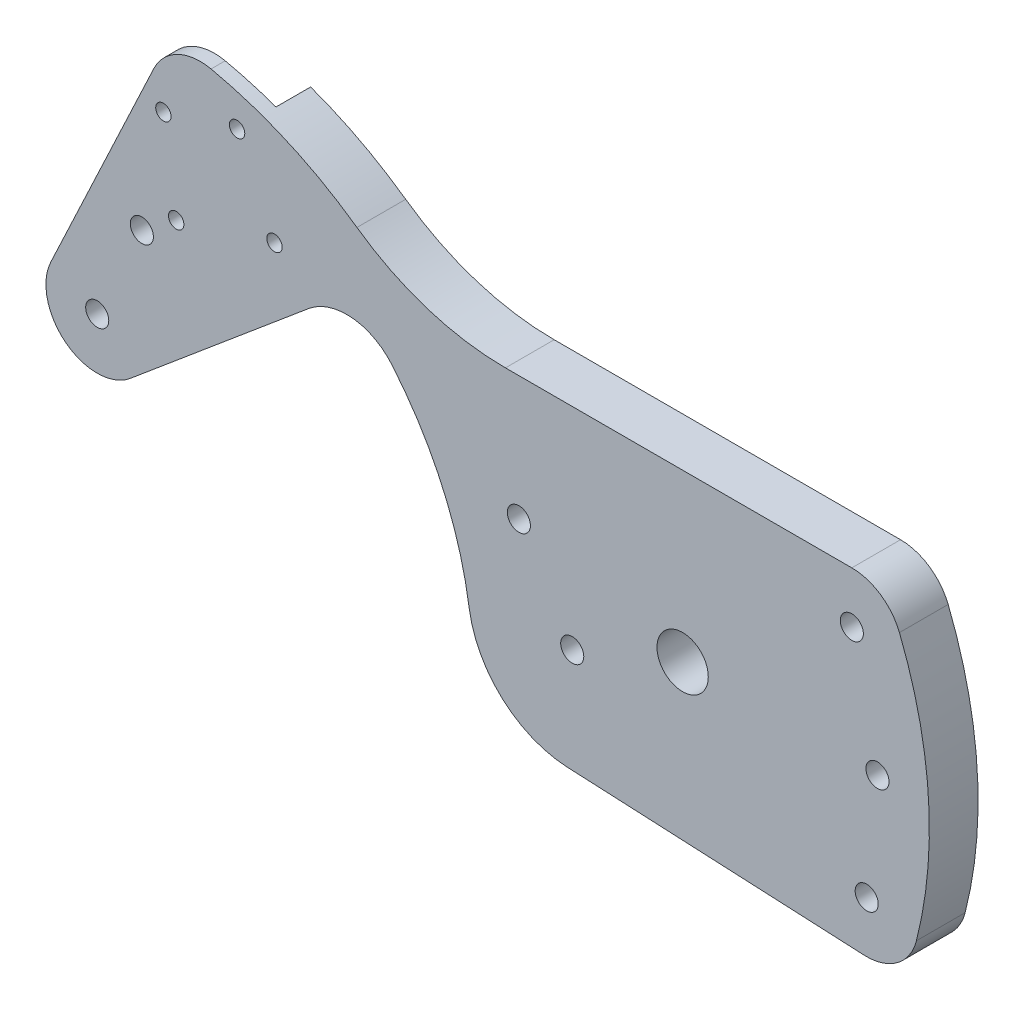
ISO-10303-21;
HEADER;
FILE_DESCRIPTION(('STEP AP214'),'2;1');
FILE_NAME('part.step','',(''),(''),'','','');
FILE_SCHEMA(('AUTOMOTIVE_DESIGN { 1 0 10303 214 1 1 1 1 }'));
ENDSEC;
DATA;
#1=APPLICATION_CONTEXT('core data for automotive mechanical design processes');
#2=APPLICATION_PROTOCOL_DEFINITION('international standard','automotive_design',2000,#1);
#3=PRODUCT_CONTEXT('',#1,'mechanical');
#4=PRODUCT('Part','Part','',(#3));
#5=PRODUCT_RELATED_PRODUCT_CATEGORY('part','',(#4));
#6=PRODUCT_DEFINITION_FORMATION('','',#4);
#7=PRODUCT_DEFINITION_CONTEXT('part definition',#1,'design');
#8=PRODUCT_DEFINITION('design','',#6,#7);
#9=PRODUCT_DEFINITION_SHAPE('','',#8);
#10=(LENGTH_UNIT() NAMED_UNIT(*) SI_UNIT(.MILLI.,.METRE.));
#11=(NAMED_UNIT(*) PLANE_ANGLE_UNIT() SI_UNIT($,.RADIAN.));
#12=(NAMED_UNIT(*) SI_UNIT($,.STERADIAN.) SOLID_ANGLE_UNIT());
#13=UNCERTAINTY_MEASURE_WITH_UNIT(LENGTH_MEASURE(1.E-05),#10,'distance_accuracy_value','');
#14=(GEOMETRIC_REPRESENTATION_CONTEXT(3) GLOBAL_UNCERTAINTY_ASSIGNED_CONTEXT((#13)) GLOBAL_UNIT_ASSIGNED_CONTEXT((#10,
#11,#12)) REPRESENTATION_CONTEXT('',''));
#15=CARTESIAN_POINT('',(0.,0.,0.));
#16=DIRECTION('',(0.,0.,1.));
#17=DIRECTION('',(1.,0.,0.));
#18=AXIS2_PLACEMENT_3D('',#15,#16,#17);
#19=CARTESIAN_POINT('',(-74.1892847970259,-68.5571228840362,-27.5));
#20=DIRECTION('',(-0.95769511445002,-0.287784759427187,0.));
#21=DIRECTION('',(0.287784759427187,-0.95769511445002,0.));
#22=AXIS2_PLACEMENT_3D('',#19,#20,#21);
#23=PLANE('',#22);
#24=DIRECTION('',(-0.287784759427187,0.95769511445002,0.));
#25=VECTOR('',#24,1.);
#26=CARTESIAN_POINT('',(-74.1892847970259,-68.5571228840362,-27.5));
#27=LINE('',#26,#25);
#28=CARTESIAN_POINT('',(-95.9576660688243,3.88407391520334,-27.5));
#29=VERTEX_POINT('',#28);
#30=CARTESIAN_POINT('',(-106.945535827358,40.4496974975837,-27.5));
#31=VERTEX_POINT('',#30);
#32=EDGE_CURVE('E11',#29,#31,#27,.T.);
#33=ORIENTED_EDGE('',*,*,#32,.F.);
#34=DIRECTION('',(0.,0.,-1.));
#35=VECTOR('',#34,1.);
#36=CARTESIAN_POINT('',(-95.9576660688243,3.88407391520334,-34.25));
#37=LINE('',#36,#35);
#38=CARTESIAN_POINT('',(-95.9576660688243,3.88407391520334,-34.25));
#39=VERTEX_POINT('',#38);
#40=EDGE_CURVE('E363',#29,#39,#37,.T.);
#41=ORIENTED_EDGE('',*,*,#40,.T.);
#42=DIRECTION('',(0.287784759427187,-0.95769511445002,0.));
#43=VECTOR('',#42,1.);
#44=CARTESIAN_POINT('',(-86.9399558255523,-26.1252186571247,-34.25));
#45=LINE('',#44,#43);
#46=CARTESIAN_POINT('',(-106.945535827358,40.4496974975837,-34.25));
#47=VERTEX_POINT('',#46);
#48=EDGE_CURVE('E340',#47,#39,#45,.T.);
#49=ORIENTED_EDGE('',*,*,#48,.F.);
#50=DIRECTION('',(0.,0.,-1.));
#51=VECTOR('',#50,1.);
#52=CARTESIAN_POINT('',(-106.945535827358,40.4496974975837,-34.25));
#53=LINE('',#52,#51);
#54=EDGE_CURVE('E342',#31,#47,#53,.T.);
#55=ORIENTED_EDGE('',*,*,#54,.F.);
#56=EDGE_LOOP('',(#33,#41,#49,#55));
#57=FACE_BOUND('',#56,.T.);
#58=ADVANCED_FACE('F38',(#57),#23,.F.);
#59=CARTESIAN_POINT('',(-48.3315167068753,-60.7869343795021,-27.5));
#60=DIRECTION('',(0.95769511445002,0.287784759427187,0.));
#61=DIRECTION('',(-0.287784759427187,0.95769511445002,0.));
#62=AXIS2_PLACEMENT_3D('',#59,#60,#61);
#63=PLANE('',#62);
#64=DIRECTION('',(-0.287784759427187,0.95769511445002,0.));
#65=VECTOR('',#64,1.);
#66=CARTESIAN_POINT('',(-61.0821877354018,-18.3550301525907,-34.25));
#67=LINE('',#66,#65);
#68=CARTESIAN_POINT('',(-73.4421904308482,22.7768012188099,-34.25));
#69=VERTEX_POINT('',#68);
#70=CARTESIAN_POINT('',(-82.0220970357489,51.329163249051,-34.25));
#71=VERTEX_POINT('',#70);
#72=EDGE_CURVE('E191',#69,#71,#67,.T.);
#73=ORIENTED_EDGE('',*,*,#72,.F.);
#74=DIRECTION('',(0.,0.,1.));
#75=VECTOR('',#74,1.);
#76=CARTESIAN_POINT('',(-73.4421904308482,22.7768012188099,-34.25));
#77=LINE('',#76,#75);
#78=CARTESIAN_POINT('',(-73.4421904308482,22.7768012188099,-27.5));
#79=VERTEX_POINT('',#78);
#80=EDGE_CURVE('E42',#69,#79,#77,.T.);
#81=ORIENTED_EDGE('',*,*,#80,.T.);
#82=DIRECTION('',(-0.287784759427187,0.95769511445002,0.));
#83=VECTOR('',#82,1.);
#84=CARTESIAN_POINT('',(-48.3315167068753,-60.7869343795021,-27.5));
#85=LINE('',#84,#83);
#86=CARTESIAN_POINT('',(-82.0220970357489,51.3291632490509,-27.5));
#87=VERTEX_POINT('',#86);
#88=EDGE_CURVE('E47',#79,#87,#85,.T.);
#89=ORIENTED_EDGE('',*,*,#88,.T.);
#90=DIRECTION('',(0.,0.,1.));
#91=VECTOR('',#90,1.);
#92=CARTESIAN_POINT('',(-82.0220970357489,51.3291632490509,-34.25));
#93=LINE('',#92,#91);
#94=EDGE_CURVE('E347',#87,#71,#93,.F.);
#95=ORIENTED_EDGE('',*,*,#94,.T.);
#96=EDGE_LOOP('',(#73,#81,#89,#95));
#97=FACE_BOUND('',#96,.T.);
#98=ADVANCED_FACE('F40',(#97),#63,.F.);
#99=CARTESIAN_POINT('',(0.,0.,-27.5));
#100=DIRECTION('',(0.,0.,-1.));
#101=DIRECTION('',(1.,0.,0.));
#102=AXIS2_PLACEMENT_3D('',#99,#100,#101);
#103=PLANE('',#102);
#104=DIRECTION('',(0.766044443118982,0.642787609686534,0.));
#105=VECTOR('',#104,1.);
#106=CARTESIAN_POINT('',(-41.5599291638823,49.5291948890183,-27.5));
#107=LINE('',#106,#105);
#108=EDGE_CURVE('E250',#29,#79,#107,.T.);
#109=ORIENTED_EDGE('',*,*,#108,.F.);
#110=ORIENTED_EDGE('',*,*,#32,.T.);
#111=DIRECTION('',(-0.425561453382882,-0.904929527308425,0.));
#112=VECTOR('',#111,1.);
#113=CARTESIAN_POINT('',(-103.154731418742,48.5106034239492,-27.5));
#114=LINE('',#113,#112);
#115=CARTESIAN_POINT('',(-103.085929893281,48.6569055183213,-27.5));
#116=VERTEX_POINT('',#115);
#117=EDGE_CURVE('E348',#116,#31,#114,.T.);
#118=ORIENTED_EDGE('',*,*,#117,.F.);
#119=CARTESIAN_POINT('',(-94.0366346201967,44.4012909844925,-27.5));
#120=DIRECTION('',(0.,0.,1.));
#121=DIRECTION('',(1.,0.,0.));
#122=AXIS2_PLACEMENT_3D('',#119,#120,#121);
#123=CIRCLE('',#122,9.99999999999998);
#124=CARTESIAN_POINT('',(-91.9187421242096,54.174444588905,-27.5));
#125=VERTEX_POINT('',#124);
#126=EDGE_CURVE('E373',#125,#116,#123,.T.);
#127=ORIENTED_EDGE('',*,*,#126,.F.);
#128=CARTESIAN_POINT('',(-108.317782272363,-21.5,-27.5));
#129=DIRECTION('',(0.,0.,-1.));
#130=DIRECTION('',(-1.,0.,0.));
#131=AXIS2_PLACEMENT_3D('',#128,#129,#130);
#132=CIRCLE('',#131,77.4309374967139);
#133=EDGE_CURVE('E174',#125,#87,#132,.T.);
#134=ORIENTED_EDGE('',*,*,#133,.T.);
#135=ORIENTED_EDGE('',*,*,#88,.F.);
#136=EDGE_LOOP('',(#109,#110,#118,#127,#134,#135));
#137=FACE_BOUND('',#136,.T.);
#138=CARTESIAN_POINT('',(-98.7212448544347,25.2426264445703,-27.5));
#139=DIRECTION('',(0.,0.,-1.));
#140=DIRECTION('',(-1.,0.,0.));
#141=AXIS2_PLACEMENT_3D('',#138,#139,#140);
#142=CIRCLE('',#141,1.5);
#143=CARTESIAN_POINT('',(-100.221244854435,25.2426264445703,-27.5));
#144=VERTEX_POINT('',#143);
#145=EDGE_CURVE('E351',#144,#144,#142,.F.);
#146=ORIENTED_EDGE('',*,*,#145,.T.);
#147=EDGE_LOOP('',(#146));
#148=FACE_BOUND('',#147,.T.);
#149=CARTESIAN_POINT('',(-101.219347978572,42.2429052887889,-27.5));
#150=DIRECTION('',(0.,0.,-1.));
#151=DIRECTION('',(-1.,0.,0.));
#152=AXIS2_PLACEMENT_3D('',#149,#150,#151);
#153=CIRCLE('',#152,1.5);
#154=CARTESIAN_POINT('',(-102.719347978572,42.2429052887889,-27.5));
#155=VERTEX_POINT('',#154);
#156=EDGE_CURVE('E354',#155,#155,#153,.F.);
#157=ORIENTED_EDGE('',*,*,#156,.T.);
#158=EDGE_LOOP('',(#157));
#159=FACE_BOUND('',#158,.T.);
#160=CARTESIAN_POINT('',(-86.8539212618216,46.5596766801966,-27.5));
#161=DIRECTION('',(0.,0.,-1.));
#162=DIRECTION('',(-1.,0.,0.));
#163=AXIS2_PLACEMENT_3D('',#160,#161,#162);
#164=CIRCLE('',#163,1.5);
#165=CARTESIAN_POINT('',(-88.3539212618216,46.5596766801966,-27.5));
#166=VERTEX_POINT('',#165);
#167=EDGE_CURVE('E357',#166,#166,#164,.F.);
#168=ORIENTED_EDGE('',*,*,#167,.T.);
#169=EDGE_LOOP('',(#168));
#170=FACE_BOUND('',#169,.T.);
#171=CARTESIAN_POINT('',(-79.5673425654343,30.998321633114,-27.5));
#172=DIRECTION('',(0.,0.,-1.));
#173=DIRECTION('',(-1.,0.,0.));
#174=AXIS2_PLACEMENT_3D('',#171,#172,#173);
#175=CIRCLE('',#174,1.5);
#176=CARTESIAN_POINT('',(-81.0673425654343,30.998321633114,-27.5));
#177=VERTEX_POINT('',#176);
#178=EDGE_CURVE('E350',#177,#177,#175,.F.);
#179=ORIENTED_EDGE('',*,*,#178,.T.);
#180=EDGE_LOOP('',(#179));
#181=FACE_BOUND('',#180,.T.);
#182=ADVANCED_FACE('F374',(#137,#148,#159,#170,#181),#103,.T.);
#183=CARTESIAN_POINT('',(0.,0.,-34.25));
#184=DIRECTION('',(0.,0.,-1.));
#185=DIRECTION('',(1.,0.,0.));
#186=AXIS2_PLACEMENT_3D('',#183,#184,#185);
#187=PLANE('',#186);
#188=ORIENTED_EDGE('',*,*,#72,.T.);
#189=CARTESIAN_POINT('',(-108.317782272363,-21.5,-34.25));
#190=DIRECTION('',(0.,0.,1.));
#191=DIRECTION('',(1.,0.,0.));
#192=AXIS2_PLACEMENT_3D('',#189,#190,#191);
#193=CIRCLE('',#192,77.4309374967139);
#194=CARTESIAN_POINT('',(-63.4870210289497,41.6328197370912,-34.25));
#195=VERTEX_POINT('',#194);
#196=EDGE_CURVE('E55',#195,#71,#193,.T.);
#197=ORIENTED_EDGE('',*,*,#196,.F.);
#198=CARTESIAN_POINT('',(-34.5381520802066,82.4,-34.25));
#199=DIRECTION('',(0.,0.,1.));
#200=DIRECTION('',(1.,0.,0.));
#201=AXIS2_PLACEMENT_3D('',#198,#199,#200);
#202=CIRCLE('',#201,50.);
#203=CARTESIAN_POINT('',(-34.5381520802066,32.4,-34.25));
#204=VERTEX_POINT('',#203);
#205=EDGE_CURVE('E178',#195,#204,#202,.T.);
#206=ORIENTED_EDGE('',*,*,#205,.T.);
#207=DIRECTION('',(1.,0.,0.));
#208=VECTOR('',#207,1.);
#209=CARTESIAN_POINT('',(0.,32.4,-34.25));
#210=LINE('',#209,#208);
#211=CARTESIAN_POINT('',(32.9822177276365,32.4,-34.25));
#212=VERTEX_POINT('',#211);
#213=EDGE_CURVE('E222',#204,#212,#210,.T.);
#214=ORIENTED_EDGE('',*,*,#213,.T.);
#215=CARTESIAN_POINT('',(32.9822177276365,22.4,-34.25));
#216=DIRECTION('',(0.,0.,1.));
#217=DIRECTION('',(1.,0.,0.));
#218=AXIS2_PLACEMENT_3D('',#215,#216,#217);
#219=CIRCLE('',#218,9.99999999999999);
#220=CARTESIAN_POINT('',(42.2664151883936,26.1153300673927,-34.25));
#221=VERTEX_POINT('',#220);
#222=EDGE_CURVE('E219',#221,#212,#219,.T.);
#223=ORIENTED_EDGE('',*,*,#222,.F.);
#224=CARTESIAN_POINT('',(-33.3576699128129,-4.14775280898879,-34.25));
#225=DIRECTION('',(0.,0.,1.));
#226=DIRECTION('',(1.,0.,0.));
#227=AXIS2_PLACEMENT_3D('',#224,#225,#226);
#228=CIRCLE('',#227,81.4546280611314);
#229=CARTESIAN_POINT('',(45.5722671365024,-24.2704134175759,-34.25));
#230=VERTEX_POINT('',#229);
#231=EDGE_CURVE('E216',#230,#221,#228,.T.);
#232=ORIENTED_EDGE('',*,*,#231,.F.);
#233=CARTESIAN_POINT('',(35.8822177276366,-21.8,-34.25));
#234=DIRECTION('',(0.,0.,1.));
#235=DIRECTION('',(1.,0.,0.));
#236=AXIS2_PLACEMENT_3D('',#233,#234,#235);
#237=CIRCLE('',#236,9.99999999999999);
#238=CARTESIAN_POINT('',(35.3984379830354,-31.788291002905,-34.25));
#239=VERTEX_POINT('',#238);
#240=EDGE_CURVE('E213',#239,#230,#237,.T.);
#241=ORIENTED_EDGE('',*,*,#240,.F.);
#242=DIRECTION('',(-0.998829100290503,0.0483779744601208,0.));
#243=VECTOR('',#242,1.);
#244=CARTESIAN_POINT('',(-1.45320494845944,-30.0033932260633,-34.25));
#245=LINE('',#244,#243);
#246=CARTESIAN_POINT('',(-22.5002308320871,-28.9839871230938,-34.25));
#247=VERTEX_POINT('',#246);
#248=EDGE_CURVE('E210',#239,#247,#245,.T.);
#249=ORIENTED_EDGE('',*,*,#248,.T.);
#250=CARTESIAN_POINT('',(-21.5177822723635,-8.70000000000001,-34.25));
#251=DIRECTION('',(0.,0.,1.));
#252=DIRECTION('',(1.,0.,0.));
#253=AXIS2_PLACEMENT_3D('',#250,#251,#252);
#254=CIRCLE('',#253,20.3077654797946);
#255=CARTESIAN_POINT('',(-41.6082780723541,-11.662653758524,-34.25));
#256=VERTEX_POINT('',#255);
#257=EDGE_CURVE('E207',#256,#247,#254,.T.);
#258=ORIENTED_EDGE('',*,*,#257,.F.);
#259=CARTESIAN_POINT('',(-108.317782272363,-21.5,-34.25));
#260=DIRECTION('',(0.,0.,1.));
#261=DIRECTION('',(1.,0.,0.));
#262=AXIS2_PLACEMENT_3D('',#259,#260,#261);
#263=CIRCLE('',#262,67.4309374967139);
#264=CARTESIAN_POINT('',(-56.6626873087024,21.8437711324349,-34.25));
#265=VERTEX_POINT('',#264);
#266=EDGE_CURVE('E204',#256,#265,#263,.T.);
#267=ORIENTED_EDGE('',*,*,#266,.T.);
#268=CARTESIAN_POINT('',(-65.4725042221845,14.4514570095927,-34.25));
#269=DIRECTION('',(0.,0.,1.));
#270=DIRECTION('',(1.,0.,0.));
#271=AXIS2_PLACEMENT_3D('',#268,#269,#270);
#272=CIRCLE('',#271,11.5003992165423);
#273=CARTESIAN_POINT('',(-72.8648183450266,23.2612739230748,-34.25));
#274=VERTEX_POINT('',#273);
#275=EDGE_CURVE('E201',#265,#274,#272,.T.);
#276=ORIENTED_EDGE('',*,*,#275,.T.);
#277=DIRECTION('',(0.766044443118982,0.642787609686535,0.));
#278=VECTOR('',#277,1.);
#279=CARTESIAN_POINT('',(-41.5599291638824,49.5291948890183,-34.25));
#280=LINE('',#279,#278);
#281=EDGE_CURVE('E198',#69,#274,#280,.T.);
#282=ORIENTED_EDGE('',*,*,#281,.F.);
#283=EDGE_LOOP('',(#188,#197,#206,#214,#223,#232,#241,#249,#258,#267,#276,#282));
#284=FACE_BOUND('',#283,.T.);
#285=CARTESIAN_POINT('',(0.,0.,-34.25));
#286=DIRECTION('',(0.,0.,1.));
#287=DIRECTION('',(1.,0.,0.));
#288=AXIS2_PLACEMENT_3D('',#285,#286,#287);
#289=CIRCLE('',#288,5.);
#290=CARTESIAN_POINT('',(5.,0.,-34.25));
#291=VERTEX_POINT('',#290);
#292=EDGE_CURVE('E239',#291,#291,#289,.T.);
#293=ORIENTED_EDGE('',*,*,#292,.T.);
#294=EDGE_LOOP('',(#293));
#295=FACE_BOUND('',#294,.T.);
#296=CARTESIAN_POINT('',(-31.9177822723635,8.19999999999999,-34.25));
#297=DIRECTION('',(0.,0.,1.));
#298=DIRECTION('',(1.,0.,0.));
#299=AXIS2_PLACEMENT_3D('',#296,#297,#298);
#300=CIRCLE('',#299,2.25);
#301=CARTESIAN_POINT('',(-29.6677822723635,8.19999999999999,-34.25));
#302=VERTEX_POINT('',#301);
#303=EDGE_CURVE('E236',#302,#302,#300,.T.);
#304=ORIENTED_EDGE('',*,*,#303,.T.);
#305=EDGE_LOOP('',(#304));
#306=FACE_BOUND('',#305,.T.);
#307=CARTESIAN_POINT('',(-21.5177822723635,-8.70000000000001,-34.25));
#308=DIRECTION('',(0.,0.,1.));
#309=DIRECTION('',(1.,0.,0.));
#310=AXIS2_PLACEMENT_3D('',#307,#308,#309);
#311=CIRCLE('',#310,2.25);
#312=CARTESIAN_POINT('',(-19.2677822723635,-8.70000000000001,-34.25));
#313=VERTEX_POINT('',#312);
#314=EDGE_CURVE('E233',#313,#313,#311,.T.);
#315=ORIENTED_EDGE('',*,*,#314,.T.);
#316=EDGE_LOOP('',(#315));
#317=FACE_BOUND('',#316,.T.);
#318=CARTESIAN_POINT('',(32.9822177276365,22.4,-34.25));
#319=DIRECTION('',(0.,0.,1.));
#320=DIRECTION('',(1.,0.,0.));
#321=AXIS2_PLACEMENT_3D('',#318,#319,#320);
#322=CIRCLE('',#321,2.25);
#323=CARTESIAN_POINT('',(35.2322177276365,22.4,-34.25));
#324=VERTEX_POINT('',#323);
#325=EDGE_CURVE('E230',#324,#324,#322,.T.);
#326=ORIENTED_EDGE('',*,*,#325,.T.);
#327=EDGE_LOOP('',(#326));
#328=FACE_BOUND('',#327,.T.);
#329=CARTESIAN_POINT('',(37.9822177276365,-0.100000000000011,-34.25));
#330=DIRECTION('',(0.,0.,1.));
#331=DIRECTION('',(1.,0.,0.));
#332=AXIS2_PLACEMENT_3D('',#329,#330,#331);
#333=CIRCLE('',#332,2.25);
#334=CARTESIAN_POINT('',(40.2322177276366,-0.100000000000011,-34.25));
#335=VERTEX_POINT('',#334);
#336=EDGE_CURVE('E227',#335,#335,#333,.T.);
#337=ORIENTED_EDGE('',*,*,#336,.T.);
#338=EDGE_LOOP('',(#337));
#339=FACE_BOUND('',#338,.T.);
#340=CARTESIAN_POINT('',(35.8822177276366,-21.8,-34.25));
#341=DIRECTION('',(0.,0.,1.));
#342=DIRECTION('',(1.,0.,0.));
#343=AXIS2_PLACEMENT_3D('',#340,#341,#342);
#344=CIRCLE('',#343,2.25);
#345=CARTESIAN_POINT('',(38.1322177276366,-21.8,-34.25));
#346=VERTEX_POINT('',#345);
#347=EDGE_CURVE('E224',#346,#346,#344,.T.);
#348=ORIENTED_EDGE('',*,*,#347,.T.);
#349=EDGE_LOOP('',(#348));
#350=FACE_BOUND('',#349,.T.);
#351=ADVANCED_FACE('F188',(#284,#295,#306,#317,#328,#339,#350),#187,.T.);
#352=CARTESIAN_POINT('',(-79.5673425654343,30.998321633114,-24.75));
#353=DIRECTION('',(0.,0.,-1.));
#354=DIRECTION('',(1.,0.,0.));
#355=AXIS2_PLACEMENT_3D('',#352,#353,#354);
#356=CYLINDRICAL_SURFACE('',#355,1.5);
#357=ORIENTED_EDGE('',*,*,#178,.F.);
#358=EDGE_LOOP('',(#357));
#359=FACE_BOUND('',#358,.T.);
#360=CARTESIAN_POINT('',(-79.5673425654343,30.998321633114,-24.75));
#361=DIRECTION('',(0.,0.,1.));
#362=DIRECTION('',(1.,0.,0.));
#363=AXIS2_PLACEMENT_3D('',#360,#361,#362);
#364=CIRCLE('',#363,1.5);
#365=CARTESIAN_POINT('',(-78.0673425654343,30.998321633114,-24.75));
#366=VERTEX_POINT('',#365);
#367=EDGE_CURVE('E383',#366,#366,#364,.T.);
#368=ORIENTED_EDGE('',*,*,#367,.T.);
#369=EDGE_LOOP('',(#368));
#370=FACE_BOUND('',#369,.T.);
#371=ADVANCED_FACE('F707',(#359,#370),#356,.F.);
#372=CARTESIAN_POINT('',(-86.8539212618216,46.5596766801966,-24.75));
#373=DIRECTION('',(0.,0.,-1.));
#374=DIRECTION('',(1.,0.,0.));
#375=AXIS2_PLACEMENT_3D('',#372,#373,#374);
#376=CYLINDRICAL_SURFACE('',#375,1.5);
#377=ORIENTED_EDGE('',*,*,#167,.F.);
#378=EDGE_LOOP('',(#377));
#379=FACE_BOUND('',#378,.T.);
#380=CARTESIAN_POINT('',(-86.8539212618216,46.5596766801966,-24.75));
#381=DIRECTION('',(0.,0.,1.));
#382=DIRECTION('',(1.,0.,0.));
#383=AXIS2_PLACEMENT_3D('',#380,#381,#382);
#384=CIRCLE('',#383,1.5);
#385=CARTESIAN_POINT('',(-85.3539212618216,46.5596766801966,-24.75));
#386=VERTEX_POINT('',#385);
#387=EDGE_CURVE('E386',#386,#386,#384,.T.);
#388=ORIENTED_EDGE('',*,*,#387,.T.);
#389=EDGE_LOOP('',(#388));
#390=FACE_BOUND('',#389,.T.);
#391=ADVANCED_FACE('F698',(#379,#390),#376,.F.);
#392=CARTESIAN_POINT('',(-101.219347978572,42.2429052887889,-24.75));
#393=DIRECTION('',(0.,0.,-1.));
#394=DIRECTION('',(1.,0.,0.));
#395=AXIS2_PLACEMENT_3D('',#392,#393,#394);
#396=CYLINDRICAL_SURFACE('',#395,1.5);
#397=ORIENTED_EDGE('',*,*,#156,.F.);
#398=EDGE_LOOP('',(#397));
#399=FACE_BOUND('',#398,.T.);
#400=CARTESIAN_POINT('',(-101.219347978572,42.2429052887889,-24.75));
#401=DIRECTION('',(0.,0.,1.));
#402=DIRECTION('',(1.,0.,0.));
#403=AXIS2_PLACEMENT_3D('',#400,#401,#402);
#404=CIRCLE('',#403,1.5);
#405=CARTESIAN_POINT('',(-99.7193479785719,42.2429052887889,-24.75));
#406=VERTEX_POINT('',#405);
#407=EDGE_CURVE('E380',#406,#406,#404,.T.);
#408=ORIENTED_EDGE('',*,*,#407,.T.);
#409=EDGE_LOOP('',(#408));
#410=FACE_BOUND('',#409,.T.);
#411=ADVANCED_FACE('F392',(#399,#410),#396,.F.);
#412=CARTESIAN_POINT('',(-98.7212448544347,25.2426264445703,-24.75));
#413=DIRECTION('',(0.,0.,-1.));
#414=DIRECTION('',(1.,0.,0.));
#415=AXIS2_PLACEMENT_3D('',#412,#413,#414);
#416=CYLINDRICAL_SURFACE('',#415,1.5);
#417=ORIENTED_EDGE('',*,*,#145,.F.);
#418=EDGE_LOOP('',(#417));
#419=FACE_BOUND('',#418,.T.);
#420=CARTESIAN_POINT('',(-98.7212448544347,25.2426264445703,-24.75));
#421=DIRECTION('',(0.,0.,1.));
#422=DIRECTION('',(1.,0.,0.));
#423=AXIS2_PLACEMENT_3D('',#420,#421,#422);
#424=CIRCLE('',#423,1.5);
#425=CARTESIAN_POINT('',(-97.2212448544347,25.2426264445703,-24.75));
#426=VERTEX_POINT('',#425);
#427=EDGE_CURVE('E377',#426,#426,#424,.T.);
#428=ORIENTED_EDGE('',*,*,#427,.T.);
#429=EDGE_LOOP('',(#428));
#430=FACE_BOUND('',#429,.T.);
#431=ADVANCED_FACE('F452',(#419,#430),#416,.F.);
#432=CARTESIAN_POINT('',(-94.0366346201967,44.4012909844925,-34.25));
#433=DIRECTION('',(0.,0.,1.));
#434=DIRECTION('',(-1.,0.,0.));
#435=AXIS2_PLACEMENT_3D('',#432,#433,#434);
#436=CYLINDRICAL_SURFACE('',#435,9.99999999999999);
#437=DIRECTION('',(0.,0.,1.));
#438=VECTOR('',#437,1.);
#439=CARTESIAN_POINT('',(-103.085929893281,48.6569055183213,-34.25));
#440=LINE('',#439,#438);
#441=CARTESIAN_POINT('',(-103.085929893281,48.6569055183213,-24.75));
#442=VERTEX_POINT('',#441);
#443=EDGE_CURVE('E336',#116,#442,#440,.T.);
#444=ORIENTED_EDGE('',*,*,#443,.T.);
#445=CARTESIAN_POINT('',(-94.0366346201967,44.4012909844925,-24.75));
#446=DIRECTION('',(0.,0.,1.));
#447=DIRECTION('',(1.,0.,0.));
#448=AXIS2_PLACEMENT_3D('',#445,#446,#447);
#449=CIRCLE('',#448,9.99999999999999);
#450=CARTESIAN_POINT('',(-91.9187421242096,54.174444588905,-24.75));
#451=VERTEX_POINT('',#450);
#452=EDGE_CURVE('E252',#451,#442,#449,.T.);
#453=ORIENTED_EDGE('',*,*,#452,.F.);
#454=DIRECTION('',(0.,0.,1.));
#455=VECTOR('',#454,1.);
#456=CARTESIAN_POINT('',(-91.9187421242096,54.174444588905,-34.25));
#457=LINE('',#456,#455);
#458=EDGE_CURVE('E175',#125,#451,#457,.T.);
#459=ORIENTED_EDGE('',*,*,#458,.F.);
#460=ORIENTED_EDGE('',*,*,#126,.T.);
#461=EDGE_LOOP('',(#444,#453,#459,#460));
#462=FACE_BOUND('',#461,.T.);
#463=ADVANCED_FACE('F449',(#462),#436,.T.);
#464=CARTESIAN_POINT('',(-41.5599291638824,49.5291948890183,-34.25));
#465=DIRECTION('',(-0.642787609686535,0.766044443118982,0.));
#466=DIRECTION('',(-0.766044443118982,-0.642787609686535,0.));
#467=AXIS2_PLACEMENT_3D('',#464,#465,#466);
#468=PLANE('',#467);
#469=ORIENTED_EDGE('',*,*,#281,.T.);
#470=DIRECTION('',(0.,0.,1.));
#471=VECTOR('',#470,1.);
#472=CARTESIAN_POINT('',(-72.8648183450266,23.2612739230748,-34.25));
#473=LINE('',#472,#471);
#474=CARTESIAN_POINT('',(-72.8648183450266,23.2612739230748,-24.75));
#475=VERTEX_POINT('',#474);
#476=EDGE_CURVE('E327',#274,#475,#473,.T.);
#477=ORIENTED_EDGE('',*,*,#476,.T.);
#478=DIRECTION('',(0.766044443118982,0.642787609686535,0.));
#479=VECTOR('',#478,1.);
#480=CARTESIAN_POINT('',(-41.5599291638824,49.5291948890183,-24.75));
#481=LINE('',#480,#479);
#482=CARTESIAN_POINT('',(-107.689906175498,-5.96044443118984,-24.75));
#483=VERTEX_POINT('',#482);
#484=EDGE_CURVE('E259',#483,#475,#481,.T.);
#485=ORIENTED_EDGE('',*,*,#484,.F.);
#486=DIRECTION('',(0.,0.,1.));
#487=VECTOR('',#486,1.);
#488=CARTESIAN_POINT('',(-107.689906175498,-5.96044443118984,-34.25));
#489=LINE('',#488,#487);
#490=CARTESIAN_POINT('',(-107.689906175498,-5.96044443118984,-34.25));
#491=VERTEX_POINT('',#490);
#492=EDGE_CURVE('E330',#491,#483,#489,.T.);
#493=ORIENTED_EDGE('',*,*,#492,.F.);
#494=EDGE_CURVE('E199',#491,#39,#280,.T.);
#495=ORIENTED_EDGE('',*,*,#494,.T.);
#496=ORIENTED_EDGE('',*,*,#40,.F.);
#497=ORIENTED_EDGE('',*,*,#108,.T.);
#498=ORIENTED_EDGE('',*,*,#80,.F.);
#499=EDGE_LOOP('',(#469,#477,#485,#493,#495,#496,#497,#498));
#500=FACE_BOUND('',#499,.T.);
#501=ADVANCED_FACE('F445',(#500),#468,.F.);
#502=CARTESIAN_POINT('',(-34.5381520802066,82.4,-34.25));
#503=DIRECTION('',(0.,0.,1.));
#504=DIRECTION('',(-1.,0.,0.));
#505=AXIS2_PLACEMENT_3D('',#502,#503,#504);
#506=CYLINDRICAL_SURFACE('',#505,50.);
#507=CARTESIAN_POINT('',(-34.5381520802066,82.4,-24.75));
#508=DIRECTION('',(0.,0.,1.));
#509=DIRECTION('',(1.,0.,0.));
#510=AXIS2_PLACEMENT_3D('',#507,#508,#509);
#511=CIRCLE('',#510,50.);
#512=CARTESIAN_POINT('',(-63.4870210289497,41.6328197370912,-24.75));
#513=VERTEX_POINT('',#512);
#514=CARTESIAN_POINT('',(-34.5381520802066,32.4,-24.75));
#515=VERTEX_POINT('',#514);
#516=EDGE_CURVE('E248',#513,#515,#511,.T.);
#517=ORIENTED_EDGE('',*,*,#516,.T.);
#518=DIRECTION('',(0.,0.,1.));
#519=VECTOR('',#518,1.);
#520=CARTESIAN_POINT('',(-34.5381520802066,32.4,-34.25));
#521=LINE('',#520,#519);
#522=EDGE_CURVE('E181',#204,#515,#521,.T.);
#523=ORIENTED_EDGE('',*,*,#522,.F.);
#524=ORIENTED_EDGE('',*,*,#205,.F.);
#525=DIRECTION('',(0.,0.,1.));
#526=VECTOR('',#525,1.);
#527=CARTESIAN_POINT('',(-63.4870210289497,41.6328197370912,-34.25));
#528=LINE('',#527,#526);
#529=EDGE_CURVE('E165',#195,#513,#528,.T.);
#530=ORIENTED_EDGE('',*,*,#529,.T.);
#531=EDGE_LOOP('',(#517,#523,#524,#530));
#532=FACE_BOUND('',#531,.T.);
#533=ADVANCED_FACE('F179',(#532),#506,.F.);
#534=CARTESIAN_POINT('',(-108.317782272363,-21.5,-34.25));
#535=DIRECTION('',(0.,0.,1.));
#536=DIRECTION('',(-1.,0.,0.));
#537=AXIS2_PLACEMENT_3D('',#534,#535,#536);
#538=CYLINDRICAL_SURFACE('',#537,77.4309374967139);
#539=ORIENTED_EDGE('',*,*,#133,.F.);
#540=ORIENTED_EDGE('',*,*,#458,.T.);
#541=CARTESIAN_POINT('',(-108.317782272363,-21.5,-24.75));
#542=DIRECTION('',(0.,0.,1.));
#543=DIRECTION('',(1.,0.,0.));
#544=AXIS2_PLACEMENT_3D('',#541,#542,#543);
#545=CIRCLE('',#544,77.4309374967139);
#546=EDGE_CURVE('E170',#513,#451,#545,.T.);
#547=ORIENTED_EDGE('',*,*,#546,.F.);
#548=ORIENTED_EDGE('',*,*,#529,.F.);
#549=ORIENTED_EDGE('',*,*,#196,.T.);
#550=ORIENTED_EDGE('',*,*,#94,.F.);
#551=EDGE_LOOP('',(#539,#540,#547,#548,#549,#550));
#552=FACE_BOUND('',#551,.T.);
#553=ADVANCED_FACE('F168',(#552),#538,.T.);
#554=CARTESIAN_POINT('',(-103.154731418742,48.5106034239492,-34.25));
#555=DIRECTION('',(-0.904929527308425,0.425561453382882,0.));
#556=DIRECTION('',(-0.425561453382882,-0.904929527308425,0.));
#557=AXIS2_PLACEMENT_3D('',#554,#555,#556);
#558=PLANE('',#557);
#559=ORIENTED_EDGE('',*,*,#117,.T.);
#560=ORIENTED_EDGE('',*,*,#54,.T.);
#561=DIRECTION('',(0.425561453382882,0.904929527308425,0.));
#562=VECTOR('',#561,1.);
#563=CARTESIAN_POINT('',(-103.154731418742,48.5106034239492,-34.25));
#564=LINE('',#563,#562);
#565=CARTESIAN_POINT('',(-123.167077545448,5.9556145338288,-34.25));
#566=VERTEX_POINT('',#565);
#567=EDGE_CURVE('E63',#566,#47,#564,.T.);
#568=ORIENTED_EDGE('',*,*,#567,.F.);
#569=DIRECTION('',(0.,0.,1.));
#570=VECTOR('',#569,1.);
#571=CARTESIAN_POINT('',(-123.167077545448,5.9556145338288,-34.25));
#572=LINE('',#571,#570);
#573=CARTESIAN_POINT('',(-123.167077545448,5.9556145338288,-24.75));
#574=VERTEX_POINT('',#573);
#575=EDGE_CURVE('E333',#566,#574,#572,.T.);
#576=ORIENTED_EDGE('',*,*,#575,.T.);
#577=DIRECTION('',(0.425561453382882,0.904929527308425,0.));
#578=VECTOR('',#577,1.);
#579=CARTESIAN_POINT('',(-103.154731418742,48.5106034239492,-24.75));
#580=LINE('',#579,#578);
#581=EDGE_CURVE('E255',#574,#442,#580,.T.);
#582=ORIENTED_EDGE('',*,*,#581,.T.);
#583=ORIENTED_EDGE('',*,*,#443,.F.);
#584=EDGE_LOOP('',(#559,#560,#568,#576,#582,#583));
#585=FACE_BOUND('',#584,.T.);
#586=ADVANCED_FACE('F448',(#585),#558,.T.);
#587=CARTESIAN_POINT('',(-114.117782272363,1.69999999999999,-34.25));
#588=DIRECTION('',(0.,0.,1.));
#589=DIRECTION('',(-1.,0.,0.));
#590=AXIS2_PLACEMENT_3D('',#587,#588,#589);
#591=CYLINDRICAL_SURFACE('',#590,9.99999999999999);
#592=CARTESIAN_POINT('',(-114.117782272363,1.69999999999999,-24.75));
#593=DIRECTION('',(0.,0.,1.));
#594=DIRECTION('',(1.,0.,0.));
#595=AXIS2_PLACEMENT_3D('',#592,#593,#594);
#596=CIRCLE('',#595,9.99999999999999);
#597=EDGE_CURVE('E257',#574,#483,#596,.T.);
#598=ORIENTED_EDGE('',*,*,#597,.F.);
#599=ORIENTED_EDGE('',*,*,#575,.F.);
#600=CARTESIAN_POINT('',(-114.117782272363,1.69999999999999,-34.25));
#601=DIRECTION('',(0.,0.,1.));
#602=DIRECTION('',(1.,0.,0.));
#603=AXIS2_PLACEMENT_3D('',#600,#601,#602);
#604=CIRCLE('',#603,9.99999999999999);
#605=EDGE_CURVE('E193',#566,#491,#604,.T.);
#606=ORIENTED_EDGE('',*,*,#605,.T.);
#607=ORIENTED_EDGE('',*,*,#492,.T.);
#608=EDGE_LOOP('',(#598,#599,#606,#607));
#609=FACE_BOUND('',#608,.T.);
#610=ADVANCED_FACE('F455',(#609),#591,.T.);
#611=CARTESIAN_POINT('',(-65.4725042221845,14.4514570095927,-34.25));
#612=DIRECTION('',(0.,0.,1.));
#613=DIRECTION('',(-1.,0.,0.));
#614=AXIS2_PLACEMENT_3D('',#611,#612,#613);
#615=CYLINDRICAL_SURFACE('',#614,11.5003992165423);
#616=CARTESIAN_POINT('',(-65.4725042221845,14.4514570095927,-24.75));
#617=DIRECTION('',(0.,0.,1.));
#618=DIRECTION('',(1.,0.,0.));
#619=AXIS2_PLACEMENT_3D('',#616,#617,#618);
#620=CIRCLE('',#619,11.5003992165423);
#621=CARTESIAN_POINT('',(-56.6626873087024,21.8437711324349,-24.75));
#622=VERTEX_POINT('',#621);
#623=EDGE_CURVE('E262',#622,#475,#620,.T.);
#624=ORIENTED_EDGE('',*,*,#623,.T.);
#625=ORIENTED_EDGE('',*,*,#476,.F.);
#626=ORIENTED_EDGE('',*,*,#275,.F.);
#627=DIRECTION('',(0.,0.,1.));
#628=VECTOR('',#627,1.);
#629=CARTESIAN_POINT('',(-56.6626873087024,21.8437711324349,-34.25));
#630=LINE('',#629,#628);
#631=EDGE_CURVE('E324',#265,#622,#630,.T.);
#632=ORIENTED_EDGE('',*,*,#631,.T.);
#633=EDGE_LOOP('',(#624,#625,#626,#632));
#634=FACE_BOUND('',#633,.T.);
#635=ADVANCED_FACE('F459',(#634),#615,.F.);
#636=CARTESIAN_POINT('',(-108.317782272363,-21.5,-34.25));
#637=DIRECTION('',(0.,0.,1.));
#638=DIRECTION('',(-1.,0.,0.));
#639=AXIS2_PLACEMENT_3D('',#636,#637,#638);
#640=CYLINDRICAL_SURFACE('',#639,67.4309374967139);
#641=CARTESIAN_POINT('',(-108.317782272363,-21.5,-24.75));
#642=DIRECTION('',(0.,0.,1.));
#643=DIRECTION('',(1.,0.,0.));
#644=AXIS2_PLACEMENT_3D('',#641,#642,#643);
#645=CIRCLE('',#644,67.4309374967139);
#646=CARTESIAN_POINT('',(-41.6082780723541,-11.662653758524,-24.75));
#647=VERTEX_POINT('',#646);
#648=EDGE_CURVE('E264',#647,#622,#645,.T.);
#649=ORIENTED_EDGE('',*,*,#648,.T.);
#650=ORIENTED_EDGE('',*,*,#631,.F.);
#651=ORIENTED_EDGE('',*,*,#266,.F.);
#652=DIRECTION('',(0.,0.,1.));
#653=VECTOR('',#652,1.);
#654=CARTESIAN_POINT('',(-41.6082780723541,-11.662653758524,-34.25));
#655=LINE('',#654,#653);
#656=EDGE_CURVE('E321',#256,#647,#655,.T.);
#657=ORIENTED_EDGE('',*,*,#656,.T.);
#658=EDGE_LOOP('',(#649,#650,#651,#657));
#659=FACE_BOUND('',#658,.T.);
#660=ADVANCED_FACE('F466',(#659),#640,.F.);
#661=CARTESIAN_POINT('',(-21.5177822723635,-8.70000000000001,-34.25));
#662=DIRECTION('',(0.,0.,1.));
#663=DIRECTION('',(-1.,0.,0.));
#664=AXIS2_PLACEMENT_3D('',#661,#662,#663);
#665=CYLINDRICAL_SURFACE('',#664,20.3077654797946);
#666=CARTESIAN_POINT('',(-21.5177822723635,-8.70000000000001,-24.75));
#667=DIRECTION('',(0.,0.,1.));
#668=DIRECTION('',(1.,0.,0.));
#669=AXIS2_PLACEMENT_3D('',#666,#667,#668);
#670=CIRCLE('',#669,20.3077654797946);
#671=CARTESIAN_POINT('',(-22.5002308320871,-28.9839871230938,-24.75));
#672=VERTEX_POINT('',#671);
#673=EDGE_CURVE('E266',#647,#672,#670,.T.);
#674=ORIENTED_EDGE('',*,*,#673,.F.);
#675=ORIENTED_EDGE('',*,*,#656,.F.);
#676=ORIENTED_EDGE('',*,*,#257,.T.);
#677=DIRECTION('',(0.,0.,1.));
#678=VECTOR('',#677,1.);
#679=CARTESIAN_POINT('',(-22.5002308320871,-28.9839871230938,-34.25));
#680=LINE('',#679,#678);
#681=EDGE_CURVE('E318',#247,#672,#680,.T.);
#682=ORIENTED_EDGE('',*,*,#681,.T.);
#683=EDGE_LOOP('',(#674,#675,#676,#682));
#684=FACE_BOUND('',#683,.T.);
#685=ADVANCED_FACE('F470',(#684),#665,.T.);
#686=CARTESIAN_POINT('',(-1.45320494845944,-30.0033932260633,-34.25));
#687=DIRECTION('',(-0.0483779744601208,-0.998829100290503,0.));
#688=DIRECTION('',(0.998829100290503,-0.0483779744601208,0.));
#689=AXIS2_PLACEMENT_3D('',#686,#687,#688);
#690=PLANE('',#689);
#691=DIRECTION('',(-0.998829100290503,0.0483779744601208,0.));
#692=VECTOR('',#691,1.);
#693=CARTESIAN_POINT('',(-1.45320494845944,-30.0033932260633,-24.75));
#694=LINE('',#693,#692);
#695=CARTESIAN_POINT('',(35.3984379830354,-31.788291002905,-24.75));
#696=VERTEX_POINT('',#695);
#697=EDGE_CURVE('E269',#696,#672,#694,.T.);
#698=ORIENTED_EDGE('',*,*,#697,.T.);
#699=ORIENTED_EDGE('',*,*,#681,.F.);
#700=ORIENTED_EDGE('',*,*,#248,.F.);
#701=DIRECTION('',(0.,0.,1.));
#702=VECTOR('',#701,1.);
#703=CARTESIAN_POINT('',(35.3984379830354,-31.788291002905,-34.25));
#704=LINE('',#703,#702);
#705=EDGE_CURVE('E315',#239,#696,#704,.T.);
#706=ORIENTED_EDGE('',*,*,#705,.T.);
#707=EDGE_LOOP('',(#698,#699,#700,#706));
#708=FACE_BOUND('',#707,.T.);
#709=ADVANCED_FACE('F474',(#708),#690,.T.);
#710=CARTESIAN_POINT('',(35.8822177276366,-21.8,-34.25));
#711=DIRECTION('',(0.,0.,1.));
#712=DIRECTION('',(-1.,0.,0.));
#713=AXIS2_PLACEMENT_3D('',#710,#711,#712);
#714=CYLINDRICAL_SURFACE('',#713,9.99999999999999);
#715=CARTESIAN_POINT('',(35.8822177276366,-21.8,-24.75));
#716=DIRECTION('',(0.,0.,1.));
#717=DIRECTION('',(1.,0.,0.));
#718=AXIS2_PLACEMENT_3D('',#715,#716,#717);
#719=CIRCLE('',#718,9.99999999999999);
#720=CARTESIAN_POINT('',(45.5722671365024,-24.2704134175759,-24.75));
#721=VERTEX_POINT('',#720);
#722=EDGE_CURVE('E271',#696,#721,#719,.T.);
#723=ORIENTED_EDGE('',*,*,#722,.F.);
#724=ORIENTED_EDGE('',*,*,#705,.F.);
#725=ORIENTED_EDGE('',*,*,#240,.T.);
#726=DIRECTION('',(0.,0.,1.));
#727=VECTOR('',#726,1.);
#728=CARTESIAN_POINT('',(45.5722671365024,-24.2704134175759,-34.25));
#729=LINE('',#728,#727);
#730=EDGE_CURVE('E312',#230,#721,#729,.T.);
#731=ORIENTED_EDGE('',*,*,#730,.T.);
#732=EDGE_LOOP('',(#723,#724,#725,#731));
#733=FACE_BOUND('',#732,.T.);
#734=ADVANCED_FACE('F478',(#733),#714,.T.);
#735=CARTESIAN_POINT('',(-33.3576699128129,-4.14775280898879,-34.25));
#736=DIRECTION('',(0.,0.,1.));
#737=DIRECTION('',(-1.,0.,0.));
#738=AXIS2_PLACEMENT_3D('',#735,#736,#737);
#739=CYLINDRICAL_SURFACE('',#738,81.4546280611314);
#740=CARTESIAN_POINT('',(-33.3576699128129,-4.14775280898879,-24.75));
#741=DIRECTION('',(0.,0.,1.));
#742=DIRECTION('',(1.,0.,0.));
#743=AXIS2_PLACEMENT_3D('',#740,#741,#742);
#744=CIRCLE('',#743,81.4546280611314);
#745=CARTESIAN_POINT('',(42.2664151883936,26.1153300673927,-24.75));
#746=VERTEX_POINT('',#745);
#747=EDGE_CURVE('E274',#721,#746,#744,.T.);
#748=ORIENTED_EDGE('',*,*,#747,.F.);
#749=ORIENTED_EDGE('',*,*,#730,.F.);
#750=ORIENTED_EDGE('',*,*,#231,.T.);
#751=DIRECTION('',(0.,0.,1.));
#752=VECTOR('',#751,1.);
#753=CARTESIAN_POINT('',(42.2664151883936,26.1153300673927,-34.25));
#754=LINE('',#753,#752);
#755=EDGE_CURVE('E309',#221,#746,#754,.T.);
#756=ORIENTED_EDGE('',*,*,#755,.T.);
#757=EDGE_LOOP('',(#748,#749,#750,#756));
#758=FACE_BOUND('',#757,.T.);
#759=ADVANCED_FACE('F482',(#758),#739,.T.);
#760=CARTESIAN_POINT('',(32.9822177276365,22.4,-34.25));
#761=DIRECTION('',(0.,0.,1.));
#762=DIRECTION('',(-1.,0.,0.));
#763=AXIS2_PLACEMENT_3D('',#760,#761,#762);
#764=CYLINDRICAL_SURFACE('',#763,9.99999999999999);
#765=CARTESIAN_POINT('',(32.9822177276365,22.4,-24.75));
#766=DIRECTION('',(0.,0.,1.));
#767=DIRECTION('',(1.,0.,0.));
#768=AXIS2_PLACEMENT_3D('',#765,#766,#767);
#769=CIRCLE('',#768,9.99999999999999);
#770=CARTESIAN_POINT('',(32.9822177276365,32.4,-24.75));
#771=VERTEX_POINT('',#770);
#772=EDGE_CURVE('E277',#746,#771,#769,.T.);
#773=ORIENTED_EDGE('',*,*,#772,.F.);
#774=ORIENTED_EDGE('',*,*,#755,.F.);
#775=ORIENTED_EDGE('',*,*,#222,.T.);
#776=DIRECTION('',(0.,0.,1.));
#777=VECTOR('',#776,1.);
#778=CARTESIAN_POINT('',(32.9822177276365,32.4,-34.25));
#779=LINE('',#778,#777);
#780=EDGE_CURVE('E306',#212,#771,#779,.T.);
#781=ORIENTED_EDGE('',*,*,#780,.T.);
#782=EDGE_LOOP('',(#773,#774,#775,#781));
#783=FACE_BOUND('',#782,.T.);
#784=ADVANCED_FACE('F486',(#783),#764,.T.);
#785=CARTESIAN_POINT('',(-105.417782272363,20.2,-34.25));
#786=DIRECTION('',(0.,0.,1.));
#787=DIRECTION('',(-1.,0.,0.));
#788=AXIS2_PLACEMENT_3D('',#785,#786,#787);
#789=CYLINDRICAL_SURFACE('',#788,2.25);
#790=CARTESIAN_POINT('',(-105.417782272363,20.2,-34.25));
#791=DIRECTION('',(0.,0.,1.));
#792=DIRECTION('',(1.,0.,0.));
#793=AXIS2_PLACEMENT_3D('',#790,#791,#792);
#794=CIRCLE('',#793,2.25);
#795=CARTESIAN_POINT('',(-103.167782272363,20.2,-34.25));
#796=VERTEX_POINT('',#795);
#797=EDGE_CURVE('E242',#796,#796,#794,.T.);
#798=ORIENTED_EDGE('',*,*,#797,.F.);
#799=EDGE_LOOP('',(#798));
#800=FACE_BOUND('',#799,.T.);
#801=CARTESIAN_POINT('',(-105.417782272363,20.2,-24.75));
#802=DIRECTION('',(0.,0.,1.));
#803=DIRECTION('',(1.,0.,0.));
#804=AXIS2_PLACEMENT_3D('',#801,#802,#803);
#805=CIRCLE('',#804,2.25);
#806=CARTESIAN_POINT('',(-103.167782272363,20.2,-24.75));
#807=VERTEX_POINT('',#806);
#808=EDGE_CURVE('E300',#807,#807,#805,.T.);
#809=ORIENTED_EDGE('',*,*,#808,.T.);
#810=EDGE_LOOP('',(#809));
#811=FACE_BOUND('',#810,.T.);
#812=ADVANCED_FACE('F489',(#800,#811),#789,.F.);
#813=CARTESIAN_POINT('',(0.,0.,-34.25));
#814=DIRECTION('',(0.,0.,1.));
#815=DIRECTION('',(-1.,0.,0.));
#816=AXIS2_PLACEMENT_3D('',#813,#814,#815);
#817=CYLINDRICAL_SURFACE('',#816,5.);
#818=ORIENTED_EDGE('',*,*,#292,.F.);
#819=EDGE_LOOP('',(#818));
#820=FACE_BOUND('',#819,.T.);
#821=CARTESIAN_POINT('',(0.,0.,-24.75));
#822=DIRECTION('',(0.,0.,1.));
#823=DIRECTION('',(1.,0.,0.));
#824=AXIS2_PLACEMENT_3D('',#821,#822,#823);
#825=CIRCLE('',#824,5.);
#826=CARTESIAN_POINT('',(5.,0.,-24.75));
#827=VERTEX_POINT('',#826);
#828=EDGE_CURVE('E297',#827,#827,#825,.T.);
#829=ORIENTED_EDGE('',*,*,#828,.T.);
#830=EDGE_LOOP('',(#829));
#831=FACE_BOUND('',#830,.T.);
#832=ADVANCED_FACE('F510',(#820,#831),#817,.F.);
#833=CARTESIAN_POINT('',(-31.9177822723635,8.19999999999999,-34.25));
#834=DIRECTION('',(0.,0.,1.));
#835=DIRECTION('',(-1.,0.,0.));
#836=AXIS2_PLACEMENT_3D('',#833,#834,#835);
#837=CYLINDRICAL_SURFACE('',#836,2.25);
#838=ORIENTED_EDGE('',*,*,#303,.F.);
#839=EDGE_LOOP('',(#838));
#840=FACE_BOUND('',#839,.T.);
#841=CARTESIAN_POINT('',(-31.9177822723635,8.19999999999999,-24.75));
#842=DIRECTION('',(0.,0.,1.));
#843=DIRECTION('',(1.,0.,0.));
#844=AXIS2_PLACEMENT_3D('',#841,#842,#843);
#845=CIRCLE('',#844,2.25);
#846=CARTESIAN_POINT('',(-29.6677822723635,8.19999999999999,-24.75));
#847=VERTEX_POINT('',#846);
#848=EDGE_CURVE('E294',#847,#847,#845,.T.);
#849=ORIENTED_EDGE('',*,*,#848,.T.);
#850=EDGE_LOOP('',(#849));
#851=FACE_BOUND('',#850,.T.);
#852=ADVANCED_FACE('F506',(#840,#851),#837,.F.);
#853=CARTESIAN_POINT('',(-21.5177822723635,-8.70000000000001,-34.25));
#854=DIRECTION('',(0.,0.,1.));
#855=DIRECTION('',(-1.,0.,0.));
#856=AXIS2_PLACEMENT_3D('',#853,#854,#855);
#857=CYLINDRICAL_SURFACE('',#856,2.25);
#858=ORIENTED_EDGE('',*,*,#314,.F.);
#859=EDGE_LOOP('',(#858));
#860=FACE_BOUND('',#859,.T.);
#861=CARTESIAN_POINT('',(-21.5177822723635,-8.70000000000001,-24.75));
#862=DIRECTION('',(0.,0.,1.));
#863=DIRECTION('',(1.,0.,0.));
#864=AXIS2_PLACEMENT_3D('',#861,#862,#863);
#865=CIRCLE('',#864,2.25);
#866=CARTESIAN_POINT('',(-19.2677822723635,-8.70000000000001,-24.75));
#867=VERTEX_POINT('',#866);
#868=EDGE_CURVE('E291',#867,#867,#865,.T.);
#869=ORIENTED_EDGE('',*,*,#868,.T.);
#870=EDGE_LOOP('',(#869));
#871=FACE_BOUND('',#870,.T.);
#872=ADVANCED_FACE('F502',(#860,#871),#857,.F.);
#873=CARTESIAN_POINT('',(32.9822177276365,22.4,-34.25));
#874=DIRECTION('',(0.,0.,1.));
#875=DIRECTION('',(-1.,0.,0.));
#876=AXIS2_PLACEMENT_3D('',#873,#874,#875);
#877=CYLINDRICAL_SURFACE('',#876,2.25);
#878=ORIENTED_EDGE('',*,*,#325,.F.);
#879=EDGE_LOOP('',(#878));
#880=FACE_BOUND('',#879,.T.);
#881=CARTESIAN_POINT('',(32.9822177276365,22.4,-24.75));
#882=DIRECTION('',(0.,0.,1.));
#883=DIRECTION('',(1.,0.,0.));
#884=AXIS2_PLACEMENT_3D('',#881,#882,#883);
#885=CIRCLE('',#884,2.25);
#886=CARTESIAN_POINT('',(35.2322177276365,22.4,-24.75));
#887=VERTEX_POINT('',#886);
#888=EDGE_CURVE('E288',#887,#887,#885,.T.);
#889=ORIENTED_EDGE('',*,*,#888,.T.);
#890=EDGE_LOOP('',(#889));
#891=FACE_BOUND('',#890,.T.);
#892=ADVANCED_FACE('F498',(#880,#891),#877,.F.);
#893=CARTESIAN_POINT('',(37.9822177276365,-0.100000000000011,-34.25));
#894=DIRECTION('',(0.,0.,1.));
#895=DIRECTION('',(-1.,0.,0.));
#896=AXIS2_PLACEMENT_3D('',#893,#894,#895);
#897=CYLINDRICAL_SURFACE('',#896,2.25);
#898=ORIENTED_EDGE('',*,*,#336,.F.);
#899=EDGE_LOOP('',(#898));
#900=FACE_BOUND('',#899,.T.);
#901=CARTESIAN_POINT('',(37.9822177276365,-0.100000000000011,-24.75));
#902=DIRECTION('',(0.,0.,1.));
#903=DIRECTION('',(1.,0.,0.));
#904=AXIS2_PLACEMENT_3D('',#901,#902,#903);
#905=CIRCLE('',#904,2.25);
#906=CARTESIAN_POINT('',(40.2322177276366,-0.100000000000011,-24.75));
#907=VERTEX_POINT('',#906);
#908=EDGE_CURVE('E285',#907,#907,#905,.T.);
#909=ORIENTED_EDGE('',*,*,#908,.T.);
#910=EDGE_LOOP('',(#909));
#911=FACE_BOUND('',#910,.T.);
#912=ADVANCED_FACE('F494',(#900,#911),#897,.F.);
#913=CARTESIAN_POINT('',(35.8822177276366,-21.8,-34.25));
#914=DIRECTION('',(0.,0.,1.));
#915=DIRECTION('',(-1.,0.,0.));
#916=AXIS2_PLACEMENT_3D('',#913,#914,#915);
#917=CYLINDRICAL_SURFACE('',#916,2.25);
#918=ORIENTED_EDGE('',*,*,#347,.F.);
#919=EDGE_LOOP('',(#918));
#920=FACE_BOUND('',#919,.T.);
#921=CARTESIAN_POINT('',(35.8822177276366,-21.8,-24.75));
#922=DIRECTION('',(0.,0.,1.));
#923=DIRECTION('',(1.,0.,0.));
#924=AXIS2_PLACEMENT_3D('',#921,#922,#923);
#925=CIRCLE('',#924,2.25);
#926=CARTESIAN_POINT('',(38.1322177276366,-21.8,-24.75));
#927=VERTEX_POINT('',#926);
#928=EDGE_CURVE('E282',#927,#927,#925,.T.);
#929=ORIENTED_EDGE('',*,*,#928,.T.);
#930=EDGE_LOOP('',(#929));
#931=FACE_BOUND('',#930,.T.);
#932=ADVANCED_FACE('F431',(#920,#931),#917,.F.);
#933=CARTESIAN_POINT('',(0.,32.4,-34.25));
#934=DIRECTION('',(0.,1.,0.));
#935=DIRECTION('',(0.,0.,-1.));
#936=AXIS2_PLACEMENT_3D('',#933,#934,#935);
#937=PLANE('',#936);
#938=DIRECTION('',(1.,0.,0.));
#939=VECTOR('',#938,1.);
#940=CARTESIAN_POINT('',(0.,32.4,-24.75));
#941=LINE('',#940,#939);
#942=EDGE_CURVE('E280',#515,#771,#941,.T.);
#943=ORIENTED_EDGE('',*,*,#942,.T.);
#944=ORIENTED_EDGE('',*,*,#780,.F.);
#945=ORIENTED_EDGE('',*,*,#213,.F.);
#946=ORIENTED_EDGE('',*,*,#522,.T.);
#947=EDGE_LOOP('',(#943,#944,#945,#946));
#948=FACE_BOUND('',#947,.T.);
#949=ADVANCED_FACE('F423',(#948),#937,.T.);
#950=CARTESIAN_POINT('',(-114.117782272363,1.69999999999999,-34.25));
#951=DIRECTION('',(0.,0.,1.));
#952=DIRECTION('',(-1.,0.,0.));
#953=AXIS2_PLACEMENT_3D('',#950,#951,#952);
#954=CYLINDRICAL_SURFACE('',#953,2.25);
#955=CARTESIAN_POINT('',(-114.117782272363,1.69999999999999,-34.25));
#956=DIRECTION('',(0.,0.,1.));
#957=DIRECTION('',(1.,0.,0.));
#958=AXIS2_PLACEMENT_3D('',#955,#956,#957);
#959=CIRCLE('',#958,2.25);
#960=CARTESIAN_POINT('',(-111.867782272363,1.69999999999999,-34.25));
#961=VERTEX_POINT('',#960);
#962=EDGE_CURVE('E245',#961,#961,#959,.T.);
#963=ORIENTED_EDGE('',*,*,#962,.F.);
#964=EDGE_LOOP('',(#963));
#965=FACE_BOUND('',#964,.T.);
#966=CARTESIAN_POINT('',(-114.117782272363,1.69999999999999,-24.75));
#967=DIRECTION('',(0.,0.,1.));
#968=DIRECTION('',(1.,0.,0.));
#969=AXIS2_PLACEMENT_3D('',#966,#967,#968);
#970=CIRCLE('',#969,2.25);
#971=CARTESIAN_POINT('',(-111.867782272363,1.69999999999999,-24.75));
#972=VERTEX_POINT('',#971);
#973=EDGE_CURVE('E185',#972,#972,#970,.T.);
#974=ORIENTED_EDGE('',*,*,#973,.T.);
#975=EDGE_LOOP('',(#974));
#976=FACE_BOUND('',#975,.T.);
#977=ADVANCED_FACE('F421',(#965,#976),#954,.F.);
#978=ORIENTED_EDGE('',*,*,#48,.T.);
#979=ORIENTED_EDGE('',*,*,#494,.F.);
#980=ORIENTED_EDGE('',*,*,#605,.F.);
#981=ORIENTED_EDGE('',*,*,#567,.T.);
#982=EDGE_LOOP('',(#978,#979,#980,#981));
#983=FACE_BOUND('',#982,.T.);
#984=ORIENTED_EDGE('',*,*,#797,.T.);
#985=EDGE_LOOP('',(#984));
#986=FACE_BOUND('',#985,.T.);
#987=ORIENTED_EDGE('',*,*,#962,.T.);
#988=EDGE_LOOP('',(#987));
#989=FACE_BOUND('',#988,.T.);
#990=ADVANCED_FACE('F397',(#983,#986,#989),#187,.T.);
#991=CARTESIAN_POINT('',(0.,0.,-24.75));
#992=DIRECTION('',(0.,0.,-1.));
#993=DIRECTION('',(1.,0.,0.));
#994=AXIS2_PLACEMENT_3D('',#991,#992,#993);
#995=PLANE('',#994);
#996=ORIENTED_EDGE('',*,*,#427,.F.);
#997=EDGE_LOOP('',(#996));
#998=FACE_BOUND('',#997,.T.);
#999=ORIENTED_EDGE('',*,*,#407,.F.);
#1000=EDGE_LOOP('',(#999));
#1001=FACE_BOUND('',#1000,.T.);
#1002=ORIENTED_EDGE('',*,*,#387,.F.);
#1003=EDGE_LOOP('',(#1002));
#1004=FACE_BOUND('',#1003,.T.);
#1005=ORIENTED_EDGE('',*,*,#367,.F.);
#1006=EDGE_LOOP('',(#1005));
#1007=FACE_BOUND('',#1006,.T.);
#1008=ORIENTED_EDGE('',*,*,#516,.F.);
#1009=ORIENTED_EDGE('',*,*,#546,.T.);
#1010=ORIENTED_EDGE('',*,*,#452,.T.);
#1011=ORIENTED_EDGE('',*,*,#581,.F.);
#1012=ORIENTED_EDGE('',*,*,#597,.T.);
#1013=ORIENTED_EDGE('',*,*,#484,.T.);
#1014=ORIENTED_EDGE('',*,*,#623,.F.);
#1015=ORIENTED_EDGE('',*,*,#648,.F.);
#1016=ORIENTED_EDGE('',*,*,#673,.T.);
#1017=ORIENTED_EDGE('',*,*,#697,.F.);
#1018=ORIENTED_EDGE('',*,*,#722,.T.);
#1019=ORIENTED_EDGE('',*,*,#747,.T.);
#1020=ORIENTED_EDGE('',*,*,#772,.T.);
#1021=ORIENTED_EDGE('',*,*,#942,.F.);
#1022=EDGE_LOOP('',(#1008,#1009,#1010,#1011,#1012,#1013,#1014,#1015,#1016,#1017,#1018,#1019,
#1020,#1021));
#1023=FACE_BOUND('',#1022,.T.);
#1024=ORIENTED_EDGE('',*,*,#928,.F.);
#1025=EDGE_LOOP('',(#1024));
#1026=FACE_BOUND('',#1025,.T.);
#1027=ORIENTED_EDGE('',*,*,#908,.F.);
#1028=EDGE_LOOP('',(#1027));
#1029=FACE_BOUND('',#1028,.T.);
#1030=ORIENTED_EDGE('',*,*,#888,.F.);
#1031=EDGE_LOOP('',(#1030));
#1032=FACE_BOUND('',#1031,.T.);
#1033=ORIENTED_EDGE('',*,*,#868,.F.);
#1034=EDGE_LOOP('',(#1033));
#1035=FACE_BOUND('',#1034,.T.);
#1036=ORIENTED_EDGE('',*,*,#848,.F.);
#1037=EDGE_LOOP('',(#1036));
#1038=FACE_BOUND('',#1037,.T.);
#1039=ORIENTED_EDGE('',*,*,#828,.F.);
#1040=EDGE_LOOP('',(#1039));
#1041=FACE_BOUND('',#1040,.T.);
#1042=ORIENTED_EDGE('',*,*,#808,.F.);
#1043=EDGE_LOOP('',(#1042));
#1044=FACE_BOUND('',#1043,.T.);
#1045=ORIENTED_EDGE('',*,*,#973,.F.);
#1046=EDGE_LOOP('',(#1045));
#1047=FACE_BOUND('',#1046,.T.);
#1048=ADVANCED_FACE('F394',(#998,#1001,#1004,#1007,#1023,#1026,#1029,#1032,#1035,#1038,#1041,
#1044,#1047),#995,.F.);
#1049=CLOSED_SHELL('',(#58,#98,#182,#351,#371,#391,#411,#431,#463,#501,#533,#553,#586,#610,#635,
#660,#685,#709,#734,#759,#784,#812,#832,#852,#872,#892,#912,#932,#949,#977,#990,#1048));
#1050=MANIFOLD_SOLID_BREP('B2',#1049);
#1051=ADVANCED_BREP_SHAPE_REPRESENTATION('',(#18,#1050),#14);
#1052=SHAPE_DEFINITION_REPRESENTATION(#9,#1051);
ENDSEC;
END-ISO-10303-21;
